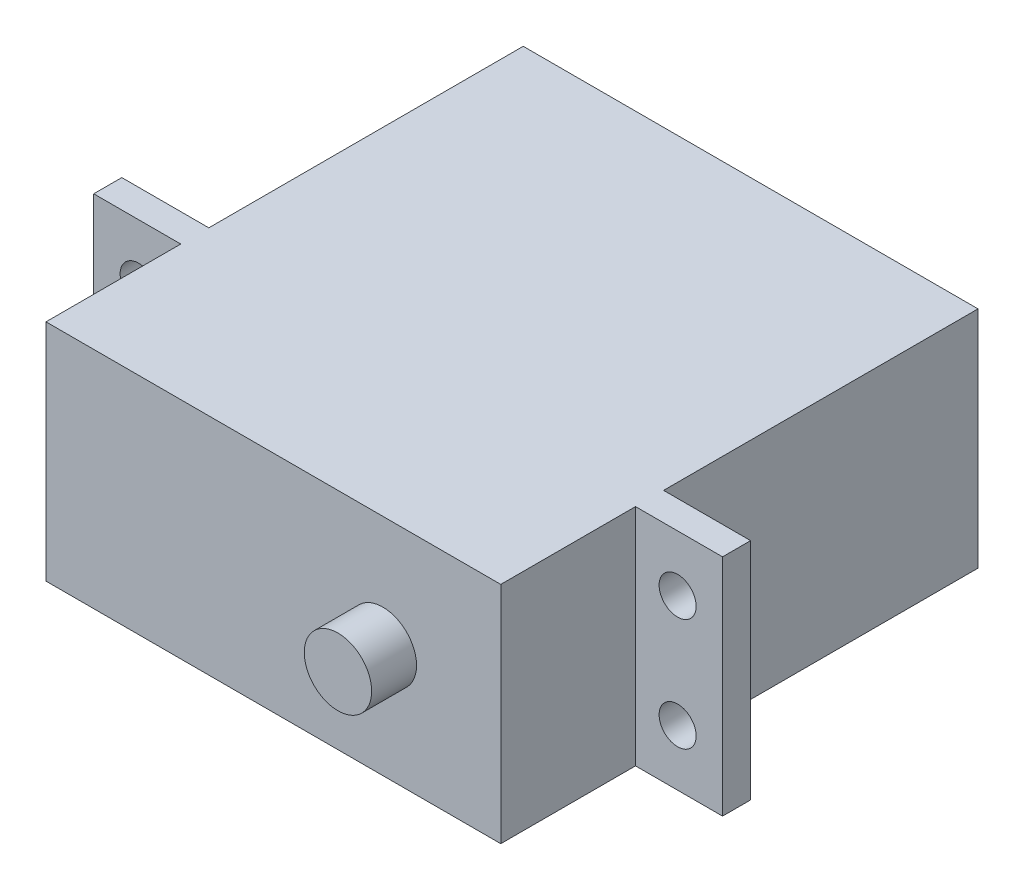
ISO-10303-21;
HEADER;
FILE_DESCRIPTION(('STEP AP214'),'2;1');
FILE_NAME('part.step','',(''),(''),'','','');
FILE_SCHEMA(('AUTOMOTIVE_DESIGN { 1 0 10303 214 1 1 1 1 }'));
ENDSEC;
DATA;
#1=APPLICATION_CONTEXT('core data for automotive mechanical design processes');
#2=APPLICATION_PROTOCOL_DEFINITION('international standard','automotive_design',2000,#1);
#3=PRODUCT_CONTEXT('',#1,'mechanical');
#4=PRODUCT('Part','Part','',(#3));
#5=PRODUCT_RELATED_PRODUCT_CATEGORY('part','',(#4));
#6=PRODUCT_DEFINITION_FORMATION('','',#4);
#7=PRODUCT_DEFINITION_CONTEXT('part definition',#1,'design');
#8=PRODUCT_DEFINITION('design','',#6,#7);
#9=PRODUCT_DEFINITION_SHAPE('','',#8);
#10=(LENGTH_UNIT() NAMED_UNIT(*) SI_UNIT(.MILLI.,.METRE.));
#11=(NAMED_UNIT(*) PLANE_ANGLE_UNIT() SI_UNIT($,.RADIAN.));
#12=(NAMED_UNIT(*) SI_UNIT($,.STERADIAN.) SOLID_ANGLE_UNIT());
#13=UNCERTAINTY_MEASURE_WITH_UNIT(LENGTH_MEASURE(1.E-05),#10,'distance_accuracy_value','');
#14=(GEOMETRIC_REPRESENTATION_CONTEXT(3) GLOBAL_UNCERTAINTY_ASSIGNED_CONTEXT((#13)) GLOBAL_UNIT_ASSIGNED_CONTEXT((#10,
#11,#12)) REPRESENTATION_CONTEXT('',''));
#15=CARTESIAN_POINT('',(0.,0.,0.));
#16=DIRECTION('',(0.,0.,1.));
#17=DIRECTION('',(1.,0.,0.));
#18=AXIS2_PLACEMENT_3D('',#15,#16,#17);
#19=CARTESIAN_POINT('',(0.,0.,30.5));
#20=DIRECTION('',(0.,0.,1.));
#21=DIRECTION('',(1.,0.,0.));
#22=AXIS2_PLACEMENT_3D('',#19,#20,#21);
#23=PLANE('',#22);
#24=DIRECTION('',(1.,0.,0.));
#25=VECTOR('',#24,1.);
#26=CARTESIAN_POINT('',(0.,0.,30.5));
#27=LINE('',#26,#25);
#28=CARTESIAN_POINT('',(40.5,0.,30.5));
#29=VERTEX_POINT('',#28);
#30=CARTESIAN_POINT('',(48.25,0.,30.5));
#31=VERTEX_POINT('',#30);
#32=EDGE_CURVE('E62',#29,#31,#27,.T.);
#33=ORIENTED_EDGE('',*,*,#32,.F.);
#34=DIRECTION('',(0.,-1.,0.));
#35=VECTOR('',#34,1.);
#36=CARTESIAN_POINT('',(40.5,0.,30.5));
#37=LINE('',#36,#35);
#38=CARTESIAN_POINT('',(40.5,-20.,30.5));
#39=VERTEX_POINT('',#38);
#40=EDGE_CURVE('E143',#29,#39,#37,.T.);
#41=ORIENTED_EDGE('',*,*,#40,.T.);
#42=DIRECTION('',(1.,0.,0.));
#43=VECTOR('',#42,1.);
#44=CARTESIAN_POINT('',(0.,-20.,30.5));
#45=LINE('',#44,#43);
#46=CARTESIAN_POINT('',(48.25,-20.,30.5));
#47=VERTEX_POINT('',#46);
#48=EDGE_CURVE('E179',#39,#47,#45,.T.);
#49=ORIENTED_EDGE('',*,*,#48,.T.);
#50=DIRECTION('',(0.,-1.,0.));
#51=VECTOR('',#50,1.);
#52=CARTESIAN_POINT('',(48.25,0.,30.5));
#53=LINE('',#52,#51);
#54=EDGE_CURVE('E183',#31,#47,#53,.T.);
#55=ORIENTED_EDGE('',*,*,#54,.F.);
#56=EDGE_LOOP('',(#33,#41,#49,#55));
#57=FACE_BOUND('',#56,.T.);
#58=CARTESIAN_POINT('',(44.25,-15.,30.5));
#59=DIRECTION('',(0.,0.,1.));
#60=DIRECTION('',(1.,0.,0.));
#61=AXIS2_PLACEMENT_3D('',#58,#59,#60);
#62=CIRCLE('',#61,1.65);
#63=CARTESIAN_POINT('',(45.9,-15.,30.5));
#64=VERTEX_POINT('',#63);
#65=EDGE_CURVE('E300',#64,#64,#62,.T.);
#66=ORIENTED_EDGE('',*,*,#65,.F.);
#67=EDGE_LOOP('',(#66));
#68=FACE_BOUND('',#67,.T.);
#69=CARTESIAN_POINT('',(44.25,-4.99999999999999,30.5));
#70=DIRECTION('',(0.,0.,1.));
#71=DIRECTION('',(1.,0.,0.));
#72=AXIS2_PLACEMENT_3D('',#69,#70,#71);
#73=CIRCLE('',#72,1.65);
#74=CARTESIAN_POINT('',(45.9,-4.99999999999999,30.5));
#75=VERTEX_POINT('',#74);
#76=EDGE_CURVE('E297',#75,#75,#73,.F.);
#77=ORIENTED_EDGE('',*,*,#76,.T.);
#78=EDGE_LOOP('',(#77));
#79=FACE_BOUND('',#78,.T.);
#80=ADVANCED_FACE('F45',(#57,#68,#79),#23,.T.);
#81=CARTESIAN_POINT('',(0.,0.,28.));
#82=DIRECTION('',(0.,0.,1.));
#83=DIRECTION('',(1.,0.,0.));
#84=AXIS2_PLACEMENT_3D('',#81,#82,#83);
#85=PLANE('',#84);
#86=CARTESIAN_POINT('',(-3.75,-5.,28.));
#87=DIRECTION('',(0.,0.,1.));
#88=DIRECTION('',(1.,0.,0.));
#89=AXIS2_PLACEMENT_3D('',#86,#87,#88);
#90=CIRCLE('',#89,1.65);
#91=CARTESIAN_POINT('',(-2.1,-5.,28.));
#92=VERTEX_POINT('',#91);
#93=EDGE_CURVE('E240',#92,#92,#90,.T.);
#94=ORIENTED_EDGE('',*,*,#93,.T.);
#95=EDGE_LOOP('',(#94));
#96=FACE_BOUND('',#95,.T.);
#97=DIRECTION('',(1.,0.,0.));
#98=VECTOR('',#97,1.);
#99=CARTESIAN_POINT('',(0.,0.,28.));
#100=LINE('',#99,#98);
#101=CARTESIAN_POINT('',(-7.75,0.,28.));
#102=VERTEX_POINT('',#101);
#103=CARTESIAN_POINT('',(0.,0.,28.));
#104=VERTEX_POINT('',#103);
#105=EDGE_CURVE('E180',#102,#104,#100,.T.);
#106=ORIENTED_EDGE('',*,*,#105,.T.);
#107=DIRECTION('',(0.,-1.,0.));
#108=VECTOR('',#107,1.);
#109=CARTESIAN_POINT('',(0.,0.,28.));
#110=LINE('',#109,#108);
#111=CARTESIAN_POINT('',(0.,-20.,28.));
#112=VERTEX_POINT('',#111);
#113=EDGE_CURVE('E212',#104,#112,#110,.T.);
#114=ORIENTED_EDGE('',*,*,#113,.T.);
#115=DIRECTION('',(1.,0.,0.));
#116=VECTOR('',#115,1.);
#117=CARTESIAN_POINT('',(0.,-20.,28.));
#118=LINE('',#117,#116);
#119=CARTESIAN_POINT('',(-7.74999999999999,-20.,28.));
#120=VERTEX_POINT('',#119);
#121=EDGE_CURVE('E192',#120,#112,#118,.T.);
#122=ORIENTED_EDGE('',*,*,#121,.F.);
#123=DIRECTION('',(0.,-1.,0.));
#124=VECTOR('',#123,1.);
#125=CARTESIAN_POINT('',(-7.75,0.,28.));
#126=LINE('',#125,#124);
#127=EDGE_CURVE('E145',#102,#120,#126,.T.);
#128=ORIENTED_EDGE('',*,*,#127,.F.);
#129=EDGE_LOOP('',(#106,#114,#122,#128));
#130=FACE_BOUND('',#129,.T.);
#131=CARTESIAN_POINT('',(-3.75,-15.,28.));
#132=DIRECTION('',(0.,0.,1.));
#133=DIRECTION('',(1.,0.,0.));
#134=AXIS2_PLACEMENT_3D('',#131,#132,#133);
#135=CIRCLE('',#134,1.65);
#136=CARTESIAN_POINT('',(-2.1,-15.,28.));
#137=VERTEX_POINT('',#136);
#138=EDGE_CURVE('E235',#137,#137,#135,.F.);
#139=ORIENTED_EDGE('',*,*,#138,.F.);
#140=EDGE_LOOP('',(#139));
#141=FACE_BOUND('',#140,.T.);
#142=ADVANCED_FACE('F269',(#96,#130,#141),#85,.F.);
#143=CARTESIAN_POINT('',(44.25,-15.,28.));
#144=DIRECTION('',(0.,0.,1.));
#145=DIRECTION('',(1.,0.,0.));
#146=AXIS2_PLACEMENT_3D('',#143,#144,#145);
#147=CIRCLE('',#146,1.65);
#148=CARTESIAN_POINT('',(45.9,-15.,28.));
#149=VERTEX_POINT('',#148);
#150=EDGE_CURVE('E233',#149,#149,#147,.T.);
#151=ORIENTED_EDGE('',*,*,#150,.T.);
#152=EDGE_LOOP('',(#151));
#153=FACE_BOUND('',#152,.T.);
#154=CARTESIAN_POINT('',(40.5,-20.,28.));
#155=VERTEX_POINT('',#154);
#156=CARTESIAN_POINT('',(48.25,-20.,28.));
#157=VERTEX_POINT('',#156);
#158=EDGE_CURVE('E191',#155,#157,#118,.T.);
#159=ORIENTED_EDGE('',*,*,#158,.F.);
#160=DIRECTION('',(0.,1.,0.));
#161=VECTOR('',#160,1.);
#162=CARTESIAN_POINT('',(40.5,0.,28.));
#163=LINE('',#162,#161);
#164=CARTESIAN_POINT('',(40.5,0.,28.));
#165=VERTEX_POINT('',#164);
#166=EDGE_CURVE('E215',#155,#165,#163,.T.);
#167=ORIENTED_EDGE('',*,*,#166,.T.);
#168=CARTESIAN_POINT('',(48.25,0.,28.));
#169=VERTEX_POINT('',#168);
#170=EDGE_CURVE('E198',#165,#169,#100,.T.);
#171=ORIENTED_EDGE('',*,*,#170,.T.);
#172=DIRECTION('',(0.,-1.,0.));
#173=VECTOR('',#172,1.);
#174=CARTESIAN_POINT('',(48.25,0.,28.));
#175=LINE('',#174,#173);
#176=EDGE_CURVE('E195',#169,#157,#175,.T.);
#177=ORIENTED_EDGE('',*,*,#176,.T.);
#178=EDGE_LOOP('',(#159,#167,#171,#177));
#179=FACE_BOUND('',#178,.T.);
#180=CARTESIAN_POINT('',(44.25,-4.99999999999999,28.));
#181=DIRECTION('',(0.,0.,1.));
#182=DIRECTION('',(1.,0.,0.));
#183=AXIS2_PLACEMENT_3D('',#180,#181,#182);
#184=CIRCLE('',#183,1.65);
#185=CARTESIAN_POINT('',(45.9,-4.99999999999999,28.));
#186=VERTEX_POINT('',#185);
#187=EDGE_CURVE('E49',#186,#186,#184,.F.);
#188=ORIENTED_EDGE('',*,*,#187,.F.);
#189=EDGE_LOOP('',(#188));
#190=FACE_BOUND('',#189,.T.);
#191=ADVANCED_FACE('F276',(#153,#179,#190),#85,.F.);
#192=DIRECTION('',(0.,-1.,0.));
#193=VECTOR('',#192,1.);
#194=CARTESIAN_POINT('',(0.,0.,30.5));
#195=LINE('',#194,#193);
#196=CARTESIAN_POINT('',(0.,0.,30.5));
#197=VERTEX_POINT('',#196);
#198=CARTESIAN_POINT('',(0.,-20.,30.5));
#199=VERTEX_POINT('',#198);
#200=EDGE_CURVE('E70',#197,#199,#195,.T.);
#201=ORIENTED_EDGE('',*,*,#200,.F.);
#202=CARTESIAN_POINT('',(-7.75,0.,30.5));
#203=VERTEX_POINT('',#202);
#204=EDGE_CURVE('E186',#203,#197,#27,.T.);
#205=ORIENTED_EDGE('',*,*,#204,.F.);
#206=DIRECTION('',(0.,-1.,0.));
#207=VECTOR('',#206,1.);
#208=CARTESIAN_POINT('',(-7.75,0.,30.5));
#209=LINE('',#208,#207);
#210=CARTESIAN_POINT('',(-7.74999999999999,-20.,30.5));
#211=VERTEX_POINT('',#210);
#212=EDGE_CURVE('E176',#203,#211,#209,.T.);
#213=ORIENTED_EDGE('',*,*,#212,.T.);
#214=EDGE_CURVE('E181',#211,#199,#45,.T.);
#215=ORIENTED_EDGE('',*,*,#214,.T.);
#216=EDGE_LOOP('',(#201,#205,#213,#215));
#217=FACE_BOUND('',#216,.T.);
#218=CARTESIAN_POINT('',(-3.75,-5.,30.5));
#219=DIRECTION('',(0.,0.,1.));
#220=DIRECTION('',(1.,0.,0.));
#221=AXIS2_PLACEMENT_3D('',#218,#219,#220);
#222=CIRCLE('',#221,1.65);
#223=CARTESIAN_POINT('',(-2.1,-5.,30.5));
#224=VERTEX_POINT('',#223);
#225=EDGE_CURVE('E245',#224,#224,#222,.T.);
#226=ORIENTED_EDGE('',*,*,#225,.F.);
#227=EDGE_LOOP('',(#226));
#228=FACE_BOUND('',#227,.T.);
#229=CARTESIAN_POINT('',(-3.75,-15.,30.5));
#230=DIRECTION('',(0.,0.,1.));
#231=DIRECTION('',(1.,0.,0.));
#232=AXIS2_PLACEMENT_3D('',#229,#230,#231);
#233=CIRCLE('',#232,1.65);
#234=CARTESIAN_POINT('',(-2.1,-15.,30.5));
#235=VERTEX_POINT('',#234);
#236=EDGE_CURVE('E295',#235,#235,#233,.F.);
#237=ORIENTED_EDGE('',*,*,#236,.T.);
#238=EDGE_LOOP('',(#237));
#239=FACE_BOUND('',#238,.T.);
#240=ADVANCED_FACE('F271',(#217,#228,#239),#23,.T.);
#241=CARTESIAN_POINT('',(0.,0.,28.));
#242=DIRECTION('',(1.,0.,0.));
#243=DIRECTION('',(0.,1.,0.));
#244=AXIS2_PLACEMENT_3D('',#241,#242,#243);
#245=PLANE('',#244);
#246=DIRECTION('',(0.,-1.,0.));
#247=VECTOR('',#246,1.);
#248=CARTESIAN_POINT('',(0.,0.,0.));
#249=LINE('',#248,#247);
#250=CARTESIAN_POINT('',(0.,0.,0.));
#251=VERTEX_POINT('',#250);
#252=CARTESIAN_POINT('',(0.,-20.,0.));
#253=VERTEX_POINT('',#252);
#254=EDGE_CURVE('E211',#251,#253,#249,.T.);
#255=ORIENTED_EDGE('',*,*,#254,.T.);
#256=DIRECTION('',(0.,0.,-1.));
#257=VECTOR('',#256,1.);
#258=CARTESIAN_POINT('',(0.,-20.,28.));
#259=LINE('',#258,#257);
#260=EDGE_CURVE('E11',#112,#253,#259,.T.);
#261=ORIENTED_EDGE('',*,*,#260,.F.);
#262=ORIENTED_EDGE('',*,*,#113,.F.);
#263=DIRECTION('',(0.,0.,-1.));
#264=VECTOR('',#263,1.);
#265=CARTESIAN_POINT('',(0.,0.,28.));
#266=LINE('',#265,#264);
#267=EDGE_CURVE('E219',#104,#251,#266,.T.);
#268=ORIENTED_EDGE('',*,*,#267,.T.);
#269=EDGE_LOOP('',(#255,#261,#262,#268));
#270=FACE_BOUND('',#269,.T.);
#271=ADVANCED_FACE('F47',(#270),#245,.F.);
#272=CARTESIAN_POINT('',(0.,-20.,28.));
#273=DIRECTION('',(0.,1.,0.));
#274=DIRECTION('',(0.,0.,1.));
#275=AXIS2_PLACEMENT_3D('',#272,#273,#274);
#276=PLANE('',#275);
#277=DIRECTION('',(1.,0.,0.));
#278=VECTOR('',#277,1.);
#279=CARTESIAN_POINT('',(0.,-20.,0.));
#280=LINE('',#279,#278);
#281=CARTESIAN_POINT('',(40.5,-20.,0.));
#282=VERTEX_POINT('',#281);
#283=EDGE_CURVE('E222',#253,#282,#280,.T.);
#284=ORIENTED_EDGE('',*,*,#283,.T.);
#285=DIRECTION('',(0.,0.,-1.));
#286=VECTOR('',#285,1.);
#287=CARTESIAN_POINT('',(40.5,-20.,28.));
#288=LINE('',#287,#286);
#289=EDGE_CURVE('E54',#155,#282,#288,.T.);
#290=ORIENTED_EDGE('',*,*,#289,.F.);
#291=ORIENTED_EDGE('',*,*,#158,.T.);
#292=DIRECTION('',(0.,0.,-1.));
#293=VECTOR('',#292,1.);
#294=CARTESIAN_POINT('',(48.25,-20.,30.5));
#295=LINE('',#294,#293);
#296=EDGE_CURVE('E205',#47,#157,#295,.T.);
#297=ORIENTED_EDGE('',*,*,#296,.F.);
#298=ORIENTED_EDGE('',*,*,#48,.F.);
#299=DIRECTION('',(0.,0.,-1.));
#300=VECTOR('',#299,1.);
#301=CARTESIAN_POINT('',(40.5,-20.,42.5));
#302=LINE('',#301,#300);
#303=CARTESIAN_POINT('',(40.5,-20.,42.5));
#304=VERTEX_POINT('',#303);
#305=EDGE_CURVE('E168',#304,#39,#302,.T.);
#306=ORIENTED_EDGE('',*,*,#305,.F.);
#307=DIRECTION('',(1.,0.,0.));
#308=VECTOR('',#307,1.);
#309=CARTESIAN_POINT('',(0.,-20.,42.5));
#310=LINE('',#309,#308);
#311=CARTESIAN_POINT('',(0.,-20.,42.5));
#312=VERTEX_POINT('',#311);
#313=EDGE_CURVE('E158',#312,#304,#310,.T.);
#314=ORIENTED_EDGE('',*,*,#313,.F.);
#315=DIRECTION('',(0.,0.,-1.));
#316=VECTOR('',#315,1.);
#317=CARTESIAN_POINT('',(0.,-20.,42.5));
#318=LINE('',#317,#316);
#319=EDGE_CURVE('E172',#312,#199,#318,.T.);
#320=ORIENTED_EDGE('',*,*,#319,.T.);
#321=ORIENTED_EDGE('',*,*,#214,.F.);
#322=DIRECTION('',(0.,0.,-1.));
#323=VECTOR('',#322,1.);
#324=CARTESIAN_POINT('',(-7.74999999999999,-20.,30.5));
#325=LINE('',#324,#323);
#326=EDGE_CURVE('E208',#211,#120,#325,.T.);
#327=ORIENTED_EDGE('',*,*,#326,.T.);
#328=ORIENTED_EDGE('',*,*,#121,.T.);
#329=ORIENTED_EDGE('',*,*,#260,.T.);
#330=EDGE_LOOP('',(#284,#290,#291,#297,#298,#306,#314,#320,#321,#327,#328,#329));
#331=FACE_BOUND('',#330,.T.);
#332=ADVANCED_FACE('F287',(#331),#276,.F.);
#333=CARTESIAN_POINT('',(40.5,0.,28.));
#334=DIRECTION('',(-1.,0.,0.));
#335=DIRECTION('',(0.,-1.,0.));
#336=AXIS2_PLACEMENT_3D('',#333,#334,#335);
#337=PLANE('',#336);
#338=DIRECTION('',(0.,1.,0.));
#339=VECTOR('',#338,1.);
#340=CARTESIAN_POINT('',(40.5,0.,0.));
#341=LINE('',#340,#339);
#342=CARTESIAN_POINT('',(40.5,0.,0.));
#343=VERTEX_POINT('',#342);
#344=EDGE_CURVE('E224',#282,#343,#341,.T.);
#345=ORIENTED_EDGE('',*,*,#344,.T.);
#346=DIRECTION('',(0.,0.,-1.));
#347=VECTOR('',#346,1.);
#348=CARTESIAN_POINT('',(40.5,0.,28.));
#349=LINE('',#348,#347);
#350=EDGE_CURVE('E229',#165,#343,#349,.T.);
#351=ORIENTED_EDGE('',*,*,#350,.F.);
#352=ORIENTED_EDGE('',*,*,#166,.F.);
#353=ORIENTED_EDGE('',*,*,#289,.T.);
#354=EDGE_LOOP('',(#345,#351,#352,#353));
#355=FACE_BOUND('',#354,.T.);
#356=ADVANCED_FACE('F364',(#355),#337,.F.);
#357=CARTESIAN_POINT('',(0.,0.,28.));
#358=DIRECTION('',(0.,-1.,0.));
#359=DIRECTION('',(0.,0.,-1.));
#360=AXIS2_PLACEMENT_3D('',#357,#358,#359);
#361=PLANE('',#360);
#362=DIRECTION('',(-1.,0.,0.));
#363=VECTOR('',#362,1.);
#364=CARTESIAN_POINT('',(0.,0.,0.));
#365=LINE('',#364,#363);
#366=EDGE_CURVE('E216',#343,#251,#365,.T.);
#367=ORIENTED_EDGE('',*,*,#366,.T.);
#368=ORIENTED_EDGE('',*,*,#267,.F.);
#369=ORIENTED_EDGE('',*,*,#105,.F.);
#370=DIRECTION('',(0.,0.,-1.));
#371=VECTOR('',#370,1.);
#372=CARTESIAN_POINT('',(-7.75,0.,30.5));
#373=LINE('',#372,#371);
#374=EDGE_CURVE('E188',#203,#102,#373,.T.);
#375=ORIENTED_EDGE('',*,*,#374,.F.);
#376=ORIENTED_EDGE('',*,*,#204,.T.);
#377=DIRECTION('',(0.,0.,-1.));
#378=VECTOR('',#377,1.);
#379=CARTESIAN_POINT('',(0.,0.,42.5));
#380=LINE('',#379,#378);
#381=CARTESIAN_POINT('',(0.,0.,42.5));
#382=VERTEX_POINT('',#381);
#383=EDGE_CURVE('E146',#382,#197,#380,.T.);
#384=ORIENTED_EDGE('',*,*,#383,.F.);
#385=DIRECTION('',(-1.,0.,0.));
#386=VECTOR('',#385,1.);
#387=CARTESIAN_POINT('',(0.,0.,42.5));
#388=LINE('',#387,#386);
#389=CARTESIAN_POINT('',(40.5,0.,42.5));
#390=VERTEX_POINT('',#389);
#391=EDGE_CURVE('E149',#390,#382,#388,.T.);
#392=ORIENTED_EDGE('',*,*,#391,.F.);
#393=DIRECTION('',(0.,0.,-1.));
#394=VECTOR('',#393,1.);
#395=CARTESIAN_POINT('',(40.5,0.,42.5));
#396=LINE('',#395,#394);
#397=EDGE_CURVE('E137',#390,#29,#396,.T.);
#398=ORIENTED_EDGE('',*,*,#397,.T.);
#399=ORIENTED_EDGE('',*,*,#32,.T.);
#400=DIRECTION('',(0.,0.,-1.));
#401=VECTOR('',#400,1.);
#402=CARTESIAN_POINT('',(48.25,0.,30.5));
#403=LINE('',#402,#401);
#404=EDGE_CURVE('E202',#31,#169,#403,.T.);
#405=ORIENTED_EDGE('',*,*,#404,.T.);
#406=ORIENTED_EDGE('',*,*,#170,.F.);
#407=ORIENTED_EDGE('',*,*,#350,.T.);
#408=EDGE_LOOP('',(#367,#368,#369,#375,#376,#384,#392,#398,#399,#405,#406,#407));
#409=FACE_BOUND('',#408,.T.);
#410=ADVANCED_FACE('F150',(#409),#361,.F.);
#411=CARTESIAN_POINT('',(0.,0.,0.));
#412=DIRECTION('',(0.,0.,1.));
#413=DIRECTION('',(1.,0.,0.));
#414=AXIS2_PLACEMENT_3D('',#411,#412,#413);
#415=PLANE('',#414);
#416=ORIENTED_EDGE('',*,*,#254,.F.);
#417=ORIENTED_EDGE('',*,*,#366,.F.);
#418=ORIENTED_EDGE('',*,*,#344,.F.);
#419=ORIENTED_EDGE('',*,*,#283,.F.);
#420=EDGE_LOOP('',(#416,#417,#418,#419));
#421=FACE_BOUND('',#420,.T.);
#422=ADVANCED_FACE('F363',(#421),#415,.F.);
#423=CARTESIAN_POINT('',(-7.75,0.,30.5));
#424=DIRECTION('',(1.,0.,0.));
#425=DIRECTION('',(0.,1.,0.));
#426=AXIS2_PLACEMENT_3D('',#423,#424,#425);
#427=PLANE('',#426);
#428=ORIENTED_EDGE('',*,*,#127,.T.);
#429=ORIENTED_EDGE('',*,*,#326,.F.);
#430=ORIENTED_EDGE('',*,*,#212,.F.);
#431=ORIENTED_EDGE('',*,*,#374,.T.);
#432=EDGE_LOOP('',(#428,#429,#430,#431));
#433=FACE_BOUND('',#432,.T.);
#434=ADVANCED_FACE('F381',(#433),#427,.F.);
#435=CARTESIAN_POINT('',(48.25,0.,30.5));
#436=DIRECTION('',(1.,0.,0.));
#437=DIRECTION('',(0.,0.,-1.));
#438=AXIS2_PLACEMENT_3D('',#435,#436,#437);
#439=PLANE('',#438);
#440=ORIENTED_EDGE('',*,*,#176,.F.);
#441=ORIENTED_EDGE('',*,*,#404,.F.);
#442=ORIENTED_EDGE('',*,*,#54,.T.);
#443=ORIENTED_EDGE('',*,*,#296,.T.);
#444=EDGE_LOOP('',(#440,#441,#442,#443));
#445=FACE_BOUND('',#444,.T.);
#446=ADVANCED_FACE('F355',(#445),#439,.T.);
#447=CARTESIAN_POINT('',(40.5,0.,42.5));
#448=DIRECTION('',(1.,0.,0.));
#449=DIRECTION('',(0.,1.,0.));
#450=AXIS2_PLACEMENT_3D('',#447,#448,#449);
#451=PLANE('',#450);
#452=ORIENTED_EDGE('',*,*,#40,.F.);
#453=ORIENTED_EDGE('',*,*,#397,.F.);
#454=DIRECTION('',(0.,-1.,0.));
#455=VECTOR('',#454,1.);
#456=CARTESIAN_POINT('',(40.5,0.,42.5));
#457=LINE('',#456,#455);
#458=EDGE_CURVE('E142',#390,#304,#457,.T.);
#459=ORIENTED_EDGE('',*,*,#458,.T.);
#460=ORIENTED_EDGE('',*,*,#305,.T.);
#461=EDGE_LOOP('',(#452,#453,#459,#460));
#462=FACE_BOUND('',#461,.T.);
#463=ADVANCED_FACE('F139',(#462),#451,.T.);
#464=CARTESIAN_POINT('',(0.,0.,42.5));
#465=DIRECTION('',(1.,0.,0.));
#466=DIRECTION('',(0.,1.,0.));
#467=AXIS2_PLACEMENT_3D('',#464,#465,#466);
#468=PLANE('',#467);
#469=ORIENTED_EDGE('',*,*,#200,.T.);
#470=ORIENTED_EDGE('',*,*,#319,.F.);
#471=DIRECTION('',(0.,-1.,0.));
#472=VECTOR('',#471,1.);
#473=CARTESIAN_POINT('',(0.,0.,42.5));
#474=LINE('',#473,#472);
#475=EDGE_CURVE('E154',#382,#312,#474,.T.);
#476=ORIENTED_EDGE('',*,*,#475,.F.);
#477=ORIENTED_EDGE('',*,*,#383,.T.);
#478=EDGE_LOOP('',(#469,#470,#476,#477));
#479=FACE_BOUND('',#478,.T.);
#480=ADVANCED_FACE('F257',(#479),#468,.F.);
#481=CARTESIAN_POINT('',(0.,0.,42.5));
#482=DIRECTION('',(0.,0.,1.));
#483=DIRECTION('',(1.,0.,0.));
#484=AXIS2_PLACEMENT_3D('',#481,#482,#483);
#485=PLANE('',#484);
#486=CARTESIAN_POINT('',(30.,-10.,42.5));
#487=DIRECTION('',(0.,0.,1.));
#488=DIRECTION('',(1.,0.,0.));
#489=AXIS2_PLACEMENT_3D('',#486,#487,#488);
#490=CIRCLE('',#489,3.);
#491=CARTESIAN_POINT('',(33.,-10.,42.5));
#492=VERTEX_POINT('',#491);
#493=EDGE_CURVE('E163',#492,#492,#490,.T.);
#494=ORIENTED_EDGE('',*,*,#493,.F.);
#495=EDGE_LOOP('',(#494));
#496=FACE_BOUND('',#495,.T.);
#497=ORIENTED_EDGE('',*,*,#458,.F.);
#498=ORIENTED_EDGE('',*,*,#391,.T.);
#499=ORIENTED_EDGE('',*,*,#475,.T.);
#500=ORIENTED_EDGE('',*,*,#313,.T.);
#501=EDGE_LOOP('',(#497,#498,#499,#500));
#502=FACE_BOUND('',#501,.T.);
#503=ADVANCED_FACE('F156',(#496,#502),#485,.T.);
#504=CARTESIAN_POINT('',(30.,-10.,46.5));
#505=DIRECTION('',(0.,0.,-1.));
#506=DIRECTION('',(-1.,0.,0.));
#507=AXIS2_PLACEMENT_3D('',#504,#505,#506);
#508=CYLINDRICAL_SURFACE('',#507,3.);
#509=CARTESIAN_POINT('',(30.,-10.,46.5));
#510=DIRECTION('',(0.,0.,1.));
#511=DIRECTION('',(1.,0.,0.));
#512=AXIS2_PLACEMENT_3D('',#509,#510,#511);
#513=CIRCLE('',#512,3.);
#514=CARTESIAN_POINT('',(33.,-10.,46.5));
#515=VERTEX_POINT('',#514);
#516=EDGE_CURVE('E169',#515,#515,#513,.T.);
#517=ORIENTED_EDGE('',*,*,#516,.F.);
#518=EDGE_LOOP('',(#517));
#519=FACE_BOUND('',#518,.T.);
#520=ORIENTED_EDGE('',*,*,#493,.T.);
#521=EDGE_LOOP('',(#520));
#522=FACE_BOUND('',#521,.T.);
#523=ADVANCED_FACE('F254',(#519,#522),#508,.T.);
#524=CARTESIAN_POINT('',(30.,-10.,46.5));
#525=DIRECTION('',(0.,0.,1.));
#526=DIRECTION('',(1.,0.,0.));
#527=AXIS2_PLACEMENT_3D('',#524,#525,#526);
#528=PLANE('',#527);
#529=ORIENTED_EDGE('',*,*,#516,.T.);
#530=EDGE_LOOP('',(#529));
#531=FACE_BOUND('',#530,.T.);
#532=ADVANCED_FACE('F263',(#531),#528,.T.);
#533=CARTESIAN_POINT('',(-3.75,-5.,0.));
#534=DIRECTION('',(0.,0.,1.));
#535=DIRECTION('',(1.,0.,0.));
#536=AXIS2_PLACEMENT_3D('',#533,#534,#535);
#537=CYLINDRICAL_SURFACE('',#536,1.65);
#538=CARTESIAN_POINT('',(-2.1,-5.,30.5));
#539=CARTESIAN_POINT('',(-2.1,-5.,30.4739583333333));
#540=CARTESIAN_POINT('',(-2.1,-5.,30.4479166666667));
#541=CARTESIAN_POINT('',(-2.1,-5.,30.3958333333333));
#542=CARTESIAN_POINT('',(-2.1,-5.,30.3697916666667));
#543=CARTESIAN_POINT('',(-2.1,-5.,30.3177083333333));
#544=CARTESIAN_POINT('',(-2.1,-5.,30.2916666666667));
#545=CARTESIAN_POINT('',(-2.1,-5.,30.2395833333333));
#546=CARTESIAN_POINT('',(-2.1,-5.,30.2135416666667));
#547=CARTESIAN_POINT('',(-2.1,-5.,30.1614583333333));
#548=CARTESIAN_POINT('',(-2.1,-5.,30.1354166666667));
#549=CARTESIAN_POINT('',(-2.1,-5.,30.0833333333333));
#550=CARTESIAN_POINT('',(-2.1,-5.,30.0572916666667));
#551=CARTESIAN_POINT('',(-2.1,-5.,30.0052083333333));
#552=CARTESIAN_POINT('',(-2.1,-5.,29.9791666666667));
#553=CARTESIAN_POINT('',(-2.1,-5.,29.9270833333333));
#554=CARTESIAN_POINT('',(-2.1,-5.,29.9010416666667));
#555=CARTESIAN_POINT('',(-2.1,-5.,29.8489583333333));
#556=CARTESIAN_POINT('',(-2.1,-5.,29.8229166666667));
#557=CARTESIAN_POINT('',(-2.1,-5.,29.7708333333333));
#558=CARTESIAN_POINT('',(-2.1,-5.,29.7447916666667));
#559=CARTESIAN_POINT('',(-2.1,-5.,29.6927083333333));
#560=CARTESIAN_POINT('',(-2.1,-5.,29.6666666666667));
#561=CARTESIAN_POINT('',(-2.1,-5.,29.6145833333333));
#562=CARTESIAN_POINT('',(-2.1,-5.,29.5885416666667));
#563=CARTESIAN_POINT('',(-2.1,-5.,29.5364583333333));
#564=CARTESIAN_POINT('',(-2.1,-5.,29.5104166666667));
#565=CARTESIAN_POINT('',(-2.1,-5.,29.4583333333333));
#566=CARTESIAN_POINT('',(-2.1,-5.,29.4322916666667));
#567=CARTESIAN_POINT('',(-2.1,-5.,29.3802083333333));
#568=CARTESIAN_POINT('',(-2.1,-5.,29.3541666666667));
#569=CARTESIAN_POINT('',(-2.1,-5.,29.3020833333333));
#570=CARTESIAN_POINT('',(-2.1,-5.,29.2760416666667));
#571=CARTESIAN_POINT('',(-2.1,-5.,29.2239583333333));
#572=CARTESIAN_POINT('',(-2.1,-5.,29.1979166666667));
#573=CARTESIAN_POINT('',(-2.1,-5.,29.1458333333333));
#574=CARTESIAN_POINT('',(-2.1,-5.,29.1197916666667));
#575=CARTESIAN_POINT('',(-2.1,-5.,29.0677083333333));
#576=CARTESIAN_POINT('',(-2.1,-5.,29.0416666666667));
#577=CARTESIAN_POINT('',(-2.1,-5.,28.9895833333333));
#578=CARTESIAN_POINT('',(-2.1,-5.,28.9635416666667));
#579=CARTESIAN_POINT('',(-2.1,-5.,28.9114583333333));
#580=CARTESIAN_POINT('',(-2.1,-5.,28.8854166666667));
#581=CARTESIAN_POINT('',(-2.1,-5.,28.8333333333333));
#582=CARTESIAN_POINT('',(-2.1,-5.,28.8072916666667));
#583=CARTESIAN_POINT('',(-2.1,-5.,28.7552083333333));
#584=CARTESIAN_POINT('',(-2.1,-5.,28.7291666666667));
#585=CARTESIAN_POINT('',(-2.1,-5.,28.6770833333333));
#586=CARTESIAN_POINT('',(-2.1,-5.,28.6510416666667));
#587=CARTESIAN_POINT('',(-2.1,-5.,28.5989583333333));
#588=CARTESIAN_POINT('',(-2.1,-5.,28.5729166666667));
#589=CARTESIAN_POINT('',(-2.1,-5.,28.5208333333333));
#590=CARTESIAN_POINT('',(-2.1,-5.,28.4947916666667));
#591=CARTESIAN_POINT('',(-2.1,-5.,28.4427083333333));
#592=CARTESIAN_POINT('',(-2.1,-5.,28.4166666666667));
#593=CARTESIAN_POINT('',(-2.1,-5.,28.3645833333333));
#594=CARTESIAN_POINT('',(-2.1,-5.,28.3385416666667));
#595=CARTESIAN_POINT('',(-2.1,-5.,28.2864583333333));
#596=CARTESIAN_POINT('',(-2.1,-5.,28.2604166666667));
#597=CARTESIAN_POINT('',(-2.1,-5.,28.2083333333333));
#598=CARTESIAN_POINT('',(-2.1,-5.,28.1822916666667));
#599=CARTESIAN_POINT('',(-2.1,-5.,28.1302083333333));
#600=CARTESIAN_POINT('',(-2.1,-5.,28.1041666666667));
#601=CARTESIAN_POINT('',(-2.1,-5.,28.0520833333333));
#602=CARTESIAN_POINT('',(-2.1,-5.,28.0260416666667));
#603=CARTESIAN_POINT('',(-2.1,-5.,28.));
#604=B_SPLINE_CURVE_WITH_KNOTS('',3,(#538,#539,#540,#541,#542,#543,#544,#545,#546,#547,#548,
#549,#550,#551,#552,#553,#554,#555,#556,#557,#558,#559,#560,#561,#562,#563,#564,#565,#566,#567,
#568,#569,#570,#571,#572,#573,#574,#575,#576,#577,#578,#579,#580,#581,#582,#583,#584,#585,#586,
#587,#588,#589,#590,#591,#592,#593,#594,#595,#596,#597,#598,#599,#600,#601,#602,#603),
.UNSPECIFIED.,.F.,.F.,(4,2,2,2,2,2,2,2,2,2,2,2,2,2,2,2,2,2,2,2,2,2,2,2,2,2,2,2,2,2,2,2,4),(0.,
0.0781249999999983,0.15625,0.234374999999998,0.3125,0.390624999999999,0.46875,0.546874999999999,
0.625000000000001,0.703124999999999,0.781249999999997,0.859374999999999,0.937499999999997,
1.015625,1.09375,1.171875,1.25,1.328125,1.40625,1.484375,1.5625,1.640625,1.71875,1.796875,
1.87499999999999,1.953125,2.03124999999999,2.109375,2.1875,2.265625,2.34375,2.421875,2.5),.UNSPECIFIED.);
#605=EDGE_CURVE('BSEAM324',#224,#92,#604,.T.);
#606=ORIENTED_EDGE('',*,*,#225,.T.);
#607=ORIENTED_EDGE('',*,*,#93,.F.);
#608=ORIENTED_EDGE('',*,*,#605,.T.);
#609=ORIENTED_EDGE('',*,*,#605,.F.);
#610=EDGE_LOOP('',(#606,#608,#607,#609));
#611=FACE_BOUND('',#610,.T.);
#612=ADVANCED_FACE('F324',(#611),#537,.F.);
#613=CARTESIAN_POINT('',(-3.75,-15.,0.));
#614=DIRECTION('',(0.,0.,1.));
#615=DIRECTION('',(1.,0.,0.));
#616=AXIS2_PLACEMENT_3D('',#613,#614,#615);
#617=CYLINDRICAL_SURFACE('',#616,1.65);
#618=CARTESIAN_POINT('',(-2.1,-15.,30.5));
#619=CARTESIAN_POINT('',(-2.1,-15.,30.4739583333333));
#620=CARTESIAN_POINT('',(-2.1,-15.,30.4479166666667));
#621=CARTESIAN_POINT('',(-2.1,-15.,30.3958333333333));
#622=CARTESIAN_POINT('',(-2.1,-15.,30.3697916666667));
#623=CARTESIAN_POINT('',(-2.1,-15.,30.3177083333333));
#624=CARTESIAN_POINT('',(-2.1,-15.,30.2916666666667));
#625=CARTESIAN_POINT('',(-2.1,-15.,30.2395833333333));
#626=CARTESIAN_POINT('',(-2.1,-15.,30.2135416666667));
#627=CARTESIAN_POINT('',(-2.1,-15.,30.1614583333333));
#628=CARTESIAN_POINT('',(-2.1,-15.,30.1354166666667));
#629=CARTESIAN_POINT('',(-2.1,-15.,30.0833333333333));
#630=CARTESIAN_POINT('',(-2.1,-15.,30.0572916666667));
#631=CARTESIAN_POINT('',(-2.1,-15.,30.0052083333333));
#632=CARTESIAN_POINT('',(-2.1,-15.,29.9791666666667));
#633=CARTESIAN_POINT('',(-2.1,-15.,29.9270833333333));
#634=CARTESIAN_POINT('',(-2.1,-15.,29.9010416666667));
#635=CARTESIAN_POINT('',(-2.1,-15.,29.8489583333333));
#636=CARTESIAN_POINT('',(-2.1,-15.,29.8229166666667));
#637=CARTESIAN_POINT('',(-2.1,-15.,29.7708333333333));
#638=CARTESIAN_POINT('',(-2.1,-15.,29.7447916666667));
#639=CARTESIAN_POINT('',(-2.1,-15.,29.6927083333333));
#640=CARTESIAN_POINT('',(-2.1,-15.,29.6666666666667));
#641=CARTESIAN_POINT('',(-2.1,-15.,29.6145833333333));
#642=CARTESIAN_POINT('',(-2.1,-15.,29.5885416666667));
#643=CARTESIAN_POINT('',(-2.1,-15.,29.5364583333333));
#644=CARTESIAN_POINT('',(-2.1,-15.,29.5104166666667));
#645=CARTESIAN_POINT('',(-2.1,-15.,29.4583333333333));
#646=CARTESIAN_POINT('',(-2.1,-15.,29.4322916666667));
#647=CARTESIAN_POINT('',(-2.1,-15.,29.3802083333333));
#648=CARTESIAN_POINT('',(-2.1,-15.,29.3541666666667));
#649=CARTESIAN_POINT('',(-2.1,-15.,29.3020833333333));
#650=CARTESIAN_POINT('',(-2.1,-15.,29.2760416666667));
#651=CARTESIAN_POINT('',(-2.1,-15.,29.2239583333333));
#652=CARTESIAN_POINT('',(-2.1,-15.,29.1979166666667));
#653=CARTESIAN_POINT('',(-2.1,-15.,29.1458333333333));
#654=CARTESIAN_POINT('',(-2.1,-15.,29.1197916666667));
#655=CARTESIAN_POINT('',(-2.1,-15.,29.0677083333333));
#656=CARTESIAN_POINT('',(-2.1,-15.,29.0416666666667));
#657=CARTESIAN_POINT('',(-2.1,-15.,28.9895833333333));
#658=CARTESIAN_POINT('',(-2.1,-15.,28.9635416666667));
#659=CARTESIAN_POINT('',(-2.1,-15.,28.9114583333333));
#660=CARTESIAN_POINT('',(-2.1,-15.,28.8854166666667));
#661=CARTESIAN_POINT('',(-2.1,-15.,28.8333333333333));
#662=CARTESIAN_POINT('',(-2.1,-15.,28.8072916666667));
#663=CARTESIAN_POINT('',(-2.1,-15.,28.7552083333333));
#664=CARTESIAN_POINT('',(-2.1,-15.,28.7291666666667));
#665=CARTESIAN_POINT('',(-2.1,-15.,28.6770833333333));
#666=CARTESIAN_POINT('',(-2.1,-15.,28.6510416666667));
#667=CARTESIAN_POINT('',(-2.1,-15.,28.5989583333333));
#668=CARTESIAN_POINT('',(-2.1,-15.,28.5729166666667));
#669=CARTESIAN_POINT('',(-2.1,-15.,28.5208333333333));
#670=CARTESIAN_POINT('',(-2.1,-15.,28.4947916666667));
#671=CARTESIAN_POINT('',(-2.1,-15.,28.4427083333333));
#672=CARTESIAN_POINT('',(-2.1,-15.,28.4166666666667));
#673=CARTESIAN_POINT('',(-2.1,-15.,28.3645833333333));
#674=CARTESIAN_POINT('',(-2.1,-15.,28.3385416666667));
#675=CARTESIAN_POINT('',(-2.1,-15.,28.2864583333333));
#676=CARTESIAN_POINT('',(-2.1,-15.,28.2604166666667));
#677=CARTESIAN_POINT('',(-2.1,-15.,28.2083333333333));
#678=CARTESIAN_POINT('',(-2.1,-15.,28.1822916666667));
#679=CARTESIAN_POINT('',(-2.1,-15.,28.1302083333333));
#680=CARTESIAN_POINT('',(-2.1,-15.,28.1041666666667));
#681=CARTESIAN_POINT('',(-2.1,-15.,28.0520833333333));
#682=CARTESIAN_POINT('',(-2.1,-15.,28.0260416666667));
#683=CARTESIAN_POINT('',(-2.1,-15.,28.));
#684=B_SPLINE_CURVE_WITH_KNOTS('',3,(#618,#619,#620,#621,#622,#623,#624,#625,#626,#627,#628,
#629,#630,#631,#632,#633,#634,#635,#636,#637,#638,#639,#640,#641,#642,#643,#644,#645,#646,#647,
#648,#649,#650,#651,#652,#653,#654,#655,#656,#657,#658,#659,#660,#661,#662,#663,#664,#665,#666,
#667,#668,#669,#670,#671,#672,#673,#674,#675,#676,#677,#678,#679,#680,#681,#682,#683),
.UNSPECIFIED.,.F.,.F.,(4,2,2,2,2,2,2,2,2,2,2,2,2,2,2,2,2,2,2,2,2,2,2,2,2,2,2,2,2,2,2,2,4),(0.,
0.0781249999999983,0.15625,0.234374999999998,0.3125,0.390624999999999,0.46875,0.546874999999999,
0.625000000000001,0.703124999999999,0.781249999999997,0.859374999999999,0.937499999999997,
1.015625,1.09375,1.171875,1.25,1.328125,1.40625,1.484375,1.5625,1.640625,1.71875,1.796875,
1.87499999999999,1.953125,2.03124999999999,2.109375,2.1875,2.265625,2.34375,2.421875,2.5),.UNSPECIFIED.);
#685=EDGE_CURVE('BSEAM320',#235,#137,#684,.T.);
#686=ORIENTED_EDGE('',*,*,#236,.F.);
#687=ORIENTED_EDGE('',*,*,#138,.T.);
#688=ORIENTED_EDGE('',*,*,#685,.T.);
#689=ORIENTED_EDGE('',*,*,#685,.F.);
#690=EDGE_LOOP('',(#686,#688,#687,#689));
#691=FACE_BOUND('',#690,.T.);
#692=ADVANCED_FACE('F320',(#691),#617,.F.);
#693=CARTESIAN_POINT('',(44.25,-15.,0.));
#694=DIRECTION('',(0.,0.,1.));
#695=DIRECTION('',(1.,0.,0.));
#696=AXIS2_PLACEMENT_3D('',#693,#694,#695);
#697=CYLINDRICAL_SURFACE('',#696,1.65);
#698=CARTESIAN_POINT('',(45.9,-15.,30.5));
#699=CARTESIAN_POINT('',(45.9,-15.,30.4739583333333));
#700=CARTESIAN_POINT('',(45.9,-15.,30.4479166666667));
#701=CARTESIAN_POINT('',(45.9,-15.,30.3958333333333));
#702=CARTESIAN_POINT('',(45.9,-15.,30.3697916666667));
#703=CARTESIAN_POINT('',(45.9,-15.,30.3177083333333));
#704=CARTESIAN_POINT('',(45.9,-15.,30.2916666666667));
#705=CARTESIAN_POINT('',(45.9,-15.,30.2395833333333));
#706=CARTESIAN_POINT('',(45.9,-15.,30.2135416666667));
#707=CARTESIAN_POINT('',(45.9,-15.,30.1614583333333));
#708=CARTESIAN_POINT('',(45.9,-15.,30.1354166666667));
#709=CARTESIAN_POINT('',(45.9,-15.,30.0833333333333));
#710=CARTESIAN_POINT('',(45.9,-15.,30.0572916666667));
#711=CARTESIAN_POINT('',(45.9,-15.,30.0052083333333));
#712=CARTESIAN_POINT('',(45.9,-15.,29.9791666666667));
#713=CARTESIAN_POINT('',(45.9,-15.,29.9270833333333));
#714=CARTESIAN_POINT('',(45.9,-15.,29.9010416666667));
#715=CARTESIAN_POINT('',(45.9,-15.,29.8489583333333));
#716=CARTESIAN_POINT('',(45.9,-15.,29.8229166666667));
#717=CARTESIAN_POINT('',(45.9,-15.,29.7708333333333));
#718=CARTESIAN_POINT('',(45.9,-15.,29.7447916666667));
#719=CARTESIAN_POINT('',(45.9,-15.,29.6927083333333));
#720=CARTESIAN_POINT('',(45.9,-15.,29.6666666666667));
#721=CARTESIAN_POINT('',(45.9,-15.,29.6145833333333));
#722=CARTESIAN_POINT('',(45.9,-15.,29.5885416666667));
#723=CARTESIAN_POINT('',(45.9,-15.,29.5364583333333));
#724=CARTESIAN_POINT('',(45.9,-15.,29.5104166666667));
#725=CARTESIAN_POINT('',(45.9,-15.,29.4583333333333));
#726=CARTESIAN_POINT('',(45.9,-15.,29.4322916666667));
#727=CARTESIAN_POINT('',(45.9,-15.,29.3802083333333));
#728=CARTESIAN_POINT('',(45.9,-15.,29.3541666666667));
#729=CARTESIAN_POINT('',(45.9,-15.,29.3020833333333));
#730=CARTESIAN_POINT('',(45.9,-15.,29.2760416666667));
#731=CARTESIAN_POINT('',(45.9,-15.,29.2239583333333));
#732=CARTESIAN_POINT('',(45.9,-15.,29.1979166666667));
#733=CARTESIAN_POINT('',(45.9,-15.,29.1458333333333));
#734=CARTESIAN_POINT('',(45.9,-15.,29.1197916666667));
#735=CARTESIAN_POINT('',(45.9,-15.,29.0677083333333));
#736=CARTESIAN_POINT('',(45.9,-15.,29.0416666666667));
#737=CARTESIAN_POINT('',(45.9,-15.,28.9895833333333));
#738=CARTESIAN_POINT('',(45.9,-15.,28.9635416666667));
#739=CARTESIAN_POINT('',(45.9,-15.,28.9114583333333));
#740=CARTESIAN_POINT('',(45.9,-15.,28.8854166666667));
#741=CARTESIAN_POINT('',(45.9,-15.,28.8333333333333));
#742=CARTESIAN_POINT('',(45.9,-15.,28.8072916666667));
#743=CARTESIAN_POINT('',(45.9,-15.,28.7552083333333));
#744=CARTESIAN_POINT('',(45.9,-15.,28.7291666666667));
#745=CARTESIAN_POINT('',(45.9,-15.,28.6770833333333));
#746=CARTESIAN_POINT('',(45.9,-15.,28.6510416666667));
#747=CARTESIAN_POINT('',(45.9,-15.,28.5989583333333));
#748=CARTESIAN_POINT('',(45.9,-15.,28.5729166666667));
#749=CARTESIAN_POINT('',(45.9,-15.,28.5208333333333));
#750=CARTESIAN_POINT('',(45.9,-15.,28.4947916666667));
#751=CARTESIAN_POINT('',(45.9,-15.,28.4427083333333));
#752=CARTESIAN_POINT('',(45.9,-15.,28.4166666666667));
#753=CARTESIAN_POINT('',(45.9,-15.,28.3645833333333));
#754=CARTESIAN_POINT('',(45.9,-15.,28.3385416666667));
#755=CARTESIAN_POINT('',(45.9,-15.,28.2864583333333));
#756=CARTESIAN_POINT('',(45.9,-15.,28.2604166666667));
#757=CARTESIAN_POINT('',(45.9,-15.,28.2083333333333));
#758=CARTESIAN_POINT('',(45.9,-15.,28.1822916666667));
#759=CARTESIAN_POINT('',(45.9,-15.,28.1302083333333));
#760=CARTESIAN_POINT('',(45.9,-15.,28.1041666666667));
#761=CARTESIAN_POINT('',(45.9,-15.,28.0520833333333));
#762=CARTESIAN_POINT('',(45.9,-15.,28.0260416666667));
#763=CARTESIAN_POINT('',(45.9,-15.,28.));
#764=B_SPLINE_CURVE_WITH_KNOTS('',3,(#698,#699,#700,#701,#702,#703,#704,#705,#706,#707,#708,
#709,#710,#711,#712,#713,#714,#715,#716,#717,#718,#719,#720,#721,#722,#723,#724,#725,#726,#727,
#728,#729,#730,#731,#732,#733,#734,#735,#736,#737,#738,#739,#740,#741,#742,#743,#744,#745,#746,
#747,#748,#749,#750,#751,#752,#753,#754,#755,#756,#757,#758,#759,#760,#761,#762,#763),
.UNSPECIFIED.,.F.,.F.,(4,2,2,2,2,2,2,2,2,2,2,2,2,2,2,2,2,2,2,2,2,2,2,2,2,2,2,2,2,2,2,2,4),(0.,
0.0781249999999983,0.15625,0.234374999999998,0.3125,0.390624999999999,0.46875,0.546874999999999,
0.625000000000001,0.703124999999999,0.781249999999997,0.859374999999999,0.937499999999997,
1.015625,1.09375,1.171875,1.25,1.328125,1.40625,1.484375,1.5625,1.640625,1.71875,1.796875,
1.87499999999999,1.953125,2.03124999999999,2.109375,2.1875,2.265625,2.34375,2.421875,2.5),.UNSPECIFIED.);
#765=EDGE_CURVE('BSEAM306',#64,#149,#764,.T.);
#766=ORIENTED_EDGE('',*,*,#65,.T.);
#767=ORIENTED_EDGE('',*,*,#150,.F.);
#768=ORIENTED_EDGE('',*,*,#765,.T.);
#769=ORIENTED_EDGE('',*,*,#765,.F.);
#770=EDGE_LOOP('',(#766,#768,#767,#769));
#771=FACE_BOUND('',#770,.T.);
#772=ADVANCED_FACE('F306',(#771),#697,.F.);
#773=CARTESIAN_POINT('',(44.25,-4.99999999999999,0.));
#774=DIRECTION('',(0.,0.,1.));
#775=DIRECTION('',(1.,0.,0.));
#776=AXIS2_PLACEMENT_3D('',#773,#774,#775);
#777=CYLINDRICAL_SURFACE('',#776,1.65);
#778=CARTESIAN_POINT('',(45.9,-4.99999999999999,30.5));
#779=CARTESIAN_POINT('',(45.9,-4.99999999999999,30.4739583333333));
#780=CARTESIAN_POINT('',(45.9,-4.99999999999999,30.4479166666667));
#781=CARTESIAN_POINT('',(45.9,-4.99999999999999,30.3958333333333));
#782=CARTESIAN_POINT('',(45.9,-4.99999999999999,30.3697916666667));
#783=CARTESIAN_POINT('',(45.9,-4.99999999999999,30.3177083333333));
#784=CARTESIAN_POINT('',(45.9,-4.99999999999999,30.2916666666667));
#785=CARTESIAN_POINT('',(45.9,-4.99999999999999,30.2395833333333));
#786=CARTESIAN_POINT('',(45.9,-4.99999999999999,30.2135416666667));
#787=CARTESIAN_POINT('',(45.9,-4.99999999999999,30.1614583333333));
#788=CARTESIAN_POINT('',(45.9,-4.99999999999999,30.1354166666667));
#789=CARTESIAN_POINT('',(45.9,-4.99999999999999,30.0833333333333));
#790=CARTESIAN_POINT('',(45.9,-4.99999999999999,30.0572916666667));
#791=CARTESIAN_POINT('',(45.9,-4.99999999999999,30.0052083333333));
#792=CARTESIAN_POINT('',(45.9,-4.99999999999999,29.9791666666667));
#793=CARTESIAN_POINT('',(45.9,-4.99999999999999,29.9270833333333));
#794=CARTESIAN_POINT('',(45.9,-4.99999999999999,29.9010416666667));
#795=CARTESIAN_POINT('',(45.9,-4.99999999999999,29.8489583333333));
#796=CARTESIAN_POINT('',(45.9,-4.99999999999999,29.8229166666667));
#797=CARTESIAN_POINT('',(45.9,-4.99999999999999,29.7708333333333));
#798=CARTESIAN_POINT('',(45.9,-4.99999999999999,29.7447916666667));
#799=CARTESIAN_POINT('',(45.9,-4.99999999999999,29.6927083333333));
#800=CARTESIAN_POINT('',(45.9,-4.99999999999999,29.6666666666667));
#801=CARTESIAN_POINT('',(45.9,-4.99999999999999,29.6145833333333));
#802=CARTESIAN_POINT('',(45.9,-4.99999999999999,29.5885416666667));
#803=CARTESIAN_POINT('',(45.9,-4.99999999999999,29.5364583333333));
#804=CARTESIAN_POINT('',(45.9,-4.99999999999999,29.5104166666667));
#805=CARTESIAN_POINT('',(45.9,-4.99999999999999,29.4583333333333));
#806=CARTESIAN_POINT('',(45.9,-4.99999999999999,29.4322916666667));
#807=CARTESIAN_POINT('',(45.9,-4.99999999999999,29.3802083333333));
#808=CARTESIAN_POINT('',(45.9,-4.99999999999999,29.3541666666667));
#809=CARTESIAN_POINT('',(45.9,-4.99999999999999,29.3020833333333));
#810=CARTESIAN_POINT('',(45.9,-4.99999999999999,29.2760416666667));
#811=CARTESIAN_POINT('',(45.9,-4.99999999999999,29.2239583333333));
#812=CARTESIAN_POINT('',(45.9,-4.99999999999999,29.1979166666667));
#813=CARTESIAN_POINT('',(45.9,-4.99999999999999,29.1458333333333));
#814=CARTESIAN_POINT('',(45.9,-4.99999999999999,29.1197916666667));
#815=CARTESIAN_POINT('',(45.9,-4.99999999999999,29.0677083333333));
#816=CARTESIAN_POINT('',(45.9,-4.99999999999999,29.0416666666667));
#817=CARTESIAN_POINT('',(45.9,-4.99999999999999,28.9895833333333));
#818=CARTESIAN_POINT('',(45.9,-4.99999999999999,28.9635416666667));
#819=CARTESIAN_POINT('',(45.9,-4.99999999999999,28.9114583333333));
#820=CARTESIAN_POINT('',(45.9,-4.99999999999999,28.8854166666667));
#821=CARTESIAN_POINT('',(45.9,-4.99999999999999,28.8333333333333));
#822=CARTESIAN_POINT('',(45.9,-4.99999999999999,28.8072916666667));
#823=CARTESIAN_POINT('',(45.9,-4.99999999999999,28.7552083333333));
#824=CARTESIAN_POINT('',(45.9,-4.99999999999999,28.7291666666667));
#825=CARTESIAN_POINT('',(45.9,-4.99999999999999,28.6770833333333));
#826=CARTESIAN_POINT('',(45.9,-4.99999999999999,28.6510416666667));
#827=CARTESIAN_POINT('',(45.9,-4.99999999999999,28.5989583333333));
#828=CARTESIAN_POINT('',(45.9,-4.99999999999999,28.5729166666667));
#829=CARTESIAN_POINT('',(45.9,-4.99999999999999,28.5208333333333));
#830=CARTESIAN_POINT('',(45.9,-4.99999999999999,28.4947916666667));
#831=CARTESIAN_POINT('',(45.9,-4.99999999999999,28.4427083333333));
#832=CARTESIAN_POINT('',(45.9,-4.99999999999999,28.4166666666667));
#833=CARTESIAN_POINT('',(45.9,-4.99999999999999,28.3645833333333));
#834=CARTESIAN_POINT('',(45.9,-4.99999999999999,28.3385416666667));
#835=CARTESIAN_POINT('',(45.9,-4.99999999999999,28.2864583333333));
#836=CARTESIAN_POINT('',(45.9,-4.99999999999999,28.2604166666667));
#837=CARTESIAN_POINT('',(45.9,-4.99999999999999,28.2083333333333));
#838=CARTESIAN_POINT('',(45.9,-4.99999999999999,28.1822916666667));
#839=CARTESIAN_POINT('',(45.9,-4.99999999999999,28.1302083333333));
#840=CARTESIAN_POINT('',(45.9,-4.99999999999999,28.1041666666667));
#841=CARTESIAN_POINT('',(45.9,-4.99999999999999,28.0520833333333));
#842=CARTESIAN_POINT('',(45.9,-4.99999999999999,28.0260416666667));
#843=CARTESIAN_POINT('',(45.9,-4.99999999999999,28.));
#844=B_SPLINE_CURVE_WITH_KNOTS('',3,(#778,#779,#780,#781,#782,#783,#784,#785,#786,#787,#788,
#789,#790,#791,#792,#793,#794,#795,#796,#797,#798,#799,#800,#801,#802,#803,#804,#805,#806,#807,
#808,#809,#810,#811,#812,#813,#814,#815,#816,#817,#818,#819,#820,#821,#822,#823,#824,#825,#826,
#827,#828,#829,#830,#831,#832,#833,#834,#835,#836,#837,#838,#839,#840,#841,#842,#843),
.UNSPECIFIED.,.F.,.F.,(4,2,2,2,2,2,2,2,2,2,2,2,2,2,2,2,2,2,2,2,2,2,2,2,2,2,2,2,2,2,2,2,4),(0.,
0.0781249999999983,0.15625,0.234374999999998,0.3125,0.390624999999999,0.46875,0.546874999999999,
0.625000000000001,0.703124999999999,0.781249999999997,0.859374999999999,0.937499999999997,
1.015625,1.09375,1.171875,1.25,1.328125,1.40625,1.484375,1.5625,1.640625,1.71875,1.796875,
1.87499999999999,1.953125,2.03124999999999,2.109375,2.1875,2.265625,2.34375,2.421875,2.5),.UNSPECIFIED.);
#845=EDGE_CURVE('BSEAM311',#75,#186,#844,.T.);
#846=ORIENTED_EDGE('',*,*,#76,.F.);
#847=ORIENTED_EDGE('',*,*,#187,.T.);
#848=ORIENTED_EDGE('',*,*,#845,.T.);
#849=ORIENTED_EDGE('',*,*,#845,.F.);
#850=EDGE_LOOP('',(#846,#848,#847,#849));
#851=FACE_BOUND('',#850,.T.);
#852=ADVANCED_FACE('F311',(#851),#777,.F.);
#853=CLOSED_SHELL('',(#80,#142,#191,#240,#271,#332,#356,#410,#422,#434,#446,#463,#480,#503,#523,
#532,#612,#692,#772,#852));
#854=MANIFOLD_SOLID_BREP('B2',#853);
#855=ADVANCED_BREP_SHAPE_REPRESENTATION('',(#18,#854),#14);
#856=SHAPE_DEFINITION_REPRESENTATION(#9,#855);
ENDSEC;
END-ISO-10303-21;
